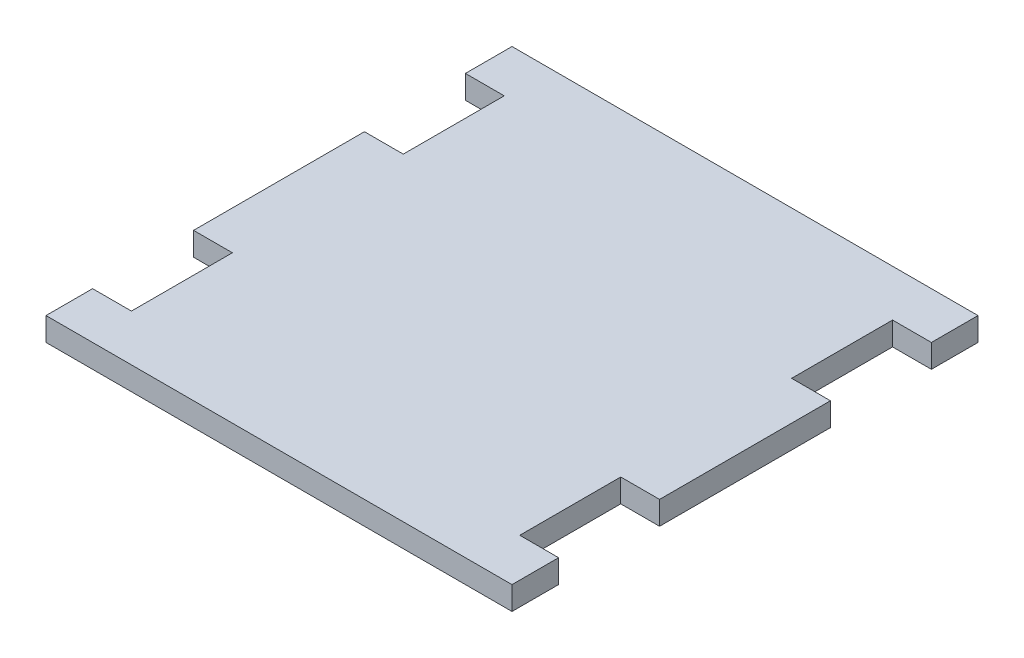
ISO-10303-21;
HEADER;
FILE_DESCRIPTION(('STEP AP214'),'2;1');
FILE_NAME('part.step','',(''),(''),'','','');
FILE_SCHEMA(('AUTOMOTIVE_DESIGN { 1 0 10303 214 1 1 1 1 }'));
ENDSEC;
DATA;
#1=APPLICATION_CONTEXT('core data for automotive mechanical design processes');
#2=APPLICATION_PROTOCOL_DEFINITION('international standard','automotive_design',2000,#1);
#3=PRODUCT_CONTEXT('',#1,'mechanical');
#4=PRODUCT('Part','Part','',(#3));
#5=PRODUCT_RELATED_PRODUCT_CATEGORY('part','',(#4));
#6=PRODUCT_DEFINITION_FORMATION('','',#4);
#7=PRODUCT_DEFINITION_CONTEXT('part definition',#1,'design');
#8=PRODUCT_DEFINITION('design','',#6,#7);
#9=PRODUCT_DEFINITION_SHAPE('','',#8);
#10=(LENGTH_UNIT() NAMED_UNIT(*) SI_UNIT(.MILLI.,.METRE.));
#11=(NAMED_UNIT(*) PLANE_ANGLE_UNIT() SI_UNIT($,.RADIAN.));
#12=(NAMED_UNIT(*) SI_UNIT($,.STERADIAN.) SOLID_ANGLE_UNIT());
#13=UNCERTAINTY_MEASURE_WITH_UNIT(LENGTH_MEASURE(1.E-05),#10,'distance_accuracy_value','');
#14=(GEOMETRIC_REPRESENTATION_CONTEXT(3) GLOBAL_UNCERTAINTY_ASSIGNED_CONTEXT((#13)) GLOBAL_UNIT_ASSIGNED_CONTEXT((#10,
#11,#12)) REPRESENTATION_CONTEXT('',''));
#15=CARTESIAN_POINT('',(0.,0.,0.));
#16=DIRECTION('',(0.,0.,1.));
#17=DIRECTION('',(1.,0.,0.));
#18=AXIS2_PLACEMENT_3D('',#15,#16,#17);
#19=CARTESIAN_POINT('',(150.,15.,150.));
#20=DIRECTION('',(-1.,0.,0.));
#21=DIRECTION('',(0.,0.,1.));
#22=AXIS2_PLACEMENT_3D('',#19,#20,#21);
#23=PLANE('',#22);
#24=DIRECTION('',(0.,1.,0.));
#25=VECTOR('',#24,1.);
#26=CARTESIAN_POINT('',(150.,-110.,-120.));
#27=LINE('',#26,#25);
#28=CARTESIAN_POINT('',(150.,0.,-120.));
#29=VERTEX_POINT('',#28);
#30=CARTESIAN_POINT('',(150.,15.,-120.));
#31=VERTEX_POINT('',#30);
#32=EDGE_CURVE('E267',#29,#31,#27,.T.);
#33=ORIENTED_EDGE('',*,*,#32,.F.);
#34=DIRECTION('',(0.,0.,-1.));
#35=VECTOR('',#34,1.);
#36=CARTESIAN_POINT('',(150.,0.,150.));
#37=LINE('',#36,#35);
#38=CARTESIAN_POINT('',(150.,0.,-150.));
#39=VERTEX_POINT('',#38);
#40=EDGE_CURVE('E266',#29,#39,#37,.T.);
#41=ORIENTED_EDGE('',*,*,#40,.T.);
#42=DIRECTION('',(0.,-1.,0.));
#43=VECTOR('',#42,1.);
#44=CARTESIAN_POINT('',(150.,15.,-150.));
#45=LINE('',#44,#43);
#46=CARTESIAN_POINT('',(150.,15.,-150.));
#47=VERTEX_POINT('',#46);
#48=EDGE_CURVE('E229',#47,#39,#45,.T.);
#49=ORIENTED_EDGE('',*,*,#48,.F.);
#50=DIRECTION('',(0.,0.,-1.));
#51=VECTOR('',#50,1.);
#52=CARTESIAN_POINT('',(150.,15.,150.));
#53=LINE('',#52,#51);
#54=EDGE_CURVE('E204',#31,#47,#53,.T.);
#55=ORIENTED_EDGE('',*,*,#54,.F.);
#56=EDGE_LOOP('',(#33,#41,#49,#55));
#57=FACE_BOUND('',#56,.T.);
#58=ADVANCED_FACE('F39',(#57),#23,.F.);
#59=CARTESIAN_POINT('',(150.,0.,55.));
#60=VERTEX_POINT('',#59);
#61=CARTESIAN_POINT('',(150.,0.,-55.));
#62=VERTEX_POINT('',#61);
#63=EDGE_CURVE('E339',#60,#62,#37,.T.);
#64=ORIENTED_EDGE('',*,*,#63,.T.);
#65=DIRECTION('',(0.,1.,0.));
#66=VECTOR('',#65,1.);
#67=CARTESIAN_POINT('',(150.,-110.,-55.));
#68=LINE('',#67,#66);
#69=CARTESIAN_POINT('',(150.,15.,-55.));
#70=VERTEX_POINT('',#69);
#71=EDGE_CURVE('E285',#62,#70,#68,.T.);
#72=ORIENTED_EDGE('',*,*,#71,.T.);
#73=CARTESIAN_POINT('',(150.,15.,55.));
#74=VERTEX_POINT('',#73);
#75=EDGE_CURVE('E205',#74,#70,#53,.T.);
#76=ORIENTED_EDGE('',*,*,#75,.F.);
#77=DIRECTION('',(0.,1.,0.));
#78=VECTOR('',#77,1.);
#79=CARTESIAN_POINT('',(150.,-110.,55.));
#80=LINE('',#79,#78);
#81=EDGE_CURVE('E186',#60,#74,#80,.T.);
#82=ORIENTED_EDGE('',*,*,#81,.F.);
#83=EDGE_LOOP('',(#64,#72,#76,#82));
#84=FACE_BOUND('',#83,.T.);
#85=ADVANCED_FACE('F380',(#84),#23,.F.);
#86=CARTESIAN_POINT('',(-150.,15.,150.));
#87=DIRECTION('',(1.,0.,0.));
#88=DIRECTION('',(0.,0.,-1.));
#89=AXIS2_PLACEMENT_3D('',#86,#87,#88);
#90=PLANE('',#89);
#91=DIRECTION('',(0.,1.,0.));
#92=VECTOR('',#91,1.);
#93=CARTESIAN_POINT('',(-150.,-110.,120.));
#94=LINE('',#93,#92);
#95=CARTESIAN_POINT('',(-150.,0.,120.));
#96=VERTEX_POINT('',#95);
#97=CARTESIAN_POINT('',(-150.,15.,120.));
#98=VERTEX_POINT('',#97);
#99=EDGE_CURVE('E286',#96,#98,#94,.T.);
#100=ORIENTED_EDGE('',*,*,#99,.F.);
#101=DIRECTION('',(0.,0.,1.));
#102=VECTOR('',#101,1.);
#103=CARTESIAN_POINT('',(-150.,0.,150.));
#104=LINE('',#103,#102);
#105=CARTESIAN_POINT('',(-150.,0.,150.));
#106=VERTEX_POINT('',#105);
#107=EDGE_CURVE('E217',#96,#106,#104,.T.);
#108=ORIENTED_EDGE('',*,*,#107,.T.);
#109=DIRECTION('',(0.,-1.,0.));
#110=VECTOR('',#109,1.);
#111=CARTESIAN_POINT('',(-150.,15.,150.));
#112=LINE('',#111,#110);
#113=CARTESIAN_POINT('',(-150.,15.,150.));
#114=VERTEX_POINT('',#113);
#115=EDGE_CURVE('E224',#114,#106,#112,.T.);
#116=ORIENTED_EDGE('',*,*,#115,.F.);
#117=DIRECTION('',(0.,0.,1.));
#118=VECTOR('',#117,1.);
#119=CARTESIAN_POINT('',(-150.,15.,150.));
#120=LINE('',#119,#118);
#121=EDGE_CURVE('E203',#98,#114,#120,.T.);
#122=ORIENTED_EDGE('',*,*,#121,.F.);
#123=EDGE_LOOP('',(#100,#108,#116,#122));
#124=FACE_BOUND('',#123,.T.);
#125=ADVANCED_FACE('F358',(#124),#90,.F.);
#126=CARTESIAN_POINT('',(-150.,0.,-55.));
#127=VERTEX_POINT('',#126);
#128=CARTESIAN_POINT('',(-150.,0.,55.));
#129=VERTEX_POINT('',#128);
#130=EDGE_CURVE('E216',#127,#129,#104,.T.);
#131=ORIENTED_EDGE('',*,*,#130,.T.);
#132=DIRECTION('',(0.,1.,0.));
#133=VECTOR('',#132,1.);
#134=CARTESIAN_POINT('',(-150.,-110.,55.));
#135=LINE('',#134,#133);
#136=CARTESIAN_POINT('',(-150.,15.,55.));
#137=VERTEX_POINT('',#136);
#138=EDGE_CURVE('E297',#129,#137,#135,.T.);
#139=ORIENTED_EDGE('',*,*,#138,.T.);
#140=CARTESIAN_POINT('',(-150.,15.,-55.));
#141=VERTEX_POINT('',#140);
#142=EDGE_CURVE('E328',#141,#137,#120,.T.);
#143=ORIENTED_EDGE('',*,*,#142,.F.);
#144=DIRECTION('',(0.,1.,0.));
#145=VECTOR('',#144,1.);
#146=CARTESIAN_POINT('',(-150.,-110.,-55.));
#147=LINE('',#146,#145);
#148=EDGE_CURVE('E311',#127,#141,#147,.T.);
#149=ORIENTED_EDGE('',*,*,#148,.F.);
#150=EDGE_LOOP('',(#131,#139,#143,#149));
#151=FACE_BOUND('',#150,.T.);
#152=ADVANCED_FACE('F335',(#151),#90,.F.);
#153=CARTESIAN_POINT('',(0.,15.,0.));
#154=DIRECTION('',(0.,-1.,0.));
#155=DIRECTION('',(0.,0.,-1.));
#156=AXIS2_PLACEMENT_3D('',#153,#154,#155);
#157=PLANE('',#156);
#158=DIRECTION('',(-1.,0.,0.));
#159=VECTOR('',#158,1.);
#160=CARTESIAN_POINT('',(150.,15.,-120.));
#161=LINE('',#160,#159);
#162=CARTESIAN_POINT('',(125.,15.,-120.));
#163=VERTEX_POINT('',#162);
#164=EDGE_CURVE('E290',#31,#163,#161,.T.);
#165=ORIENTED_EDGE('',*,*,#164,.F.);
#166=ORIENTED_EDGE('',*,*,#54,.T.);
#167=DIRECTION('',(-1.,0.,0.));
#168=VECTOR('',#167,1.);
#169=CARTESIAN_POINT('',(-150.,15.,-150.));
#170=LINE('',#169,#168);
#171=CARTESIAN_POINT('',(-150.,15.,-150.));
#172=VERTEX_POINT('',#171);
#173=EDGE_CURVE('E202',#47,#172,#170,.T.);
#174=ORIENTED_EDGE('',*,*,#173,.T.);
#175=CARTESIAN_POINT('',(-150.,15.,-120.));
#176=VERTEX_POINT('',#175);
#177=EDGE_CURVE('E333',#172,#176,#120,.T.);
#178=ORIENTED_EDGE('',*,*,#177,.T.);
#179=DIRECTION('',(-1.,0.,0.));
#180=VECTOR('',#179,1.);
#181=CARTESIAN_POINT('',(-150.,15.,-120.));
#182=LINE('',#181,#180);
#183=CARTESIAN_POINT('',(-125.,15.,-120.));
#184=VERTEX_POINT('',#183);
#185=EDGE_CURVE('E309',#184,#176,#182,.T.);
#186=ORIENTED_EDGE('',*,*,#185,.F.);
#187=DIRECTION('',(0.,0.,-1.));
#188=VECTOR('',#187,1.);
#189=CARTESIAN_POINT('',(-125.,15.,-120.));
#190=LINE('',#189,#188);
#191=CARTESIAN_POINT('',(-125.,15.,-55.));
#192=VERTEX_POINT('',#191);
#193=EDGE_CURVE('E308',#192,#184,#190,.T.);
#194=ORIENTED_EDGE('',*,*,#193,.F.);
#195=DIRECTION('',(1.,0.,0.));
#196=VECTOR('',#195,1.);
#197=CARTESIAN_POINT('',(-150.,15.,-55.));
#198=LINE('',#197,#196);
#199=EDGE_CURVE('E289',#141,#192,#198,.T.);
#200=ORIENTED_EDGE('',*,*,#199,.F.);
#201=ORIENTED_EDGE('',*,*,#142,.T.);
#202=DIRECTION('',(-1.,0.,0.));
#203=VECTOR('',#202,1.);
#204=CARTESIAN_POINT('',(-150.,15.,55.));
#205=LINE('',#204,#203);
#206=CARTESIAN_POINT('',(-125.,15.,55.));
#207=VERTEX_POINT('',#206);
#208=EDGE_CURVE('E295',#207,#137,#205,.T.);
#209=ORIENTED_EDGE('',*,*,#208,.F.);
#210=DIRECTION('',(0.,0.,-1.));
#211=VECTOR('',#210,1.);
#212=CARTESIAN_POINT('',(-125.,15.,55.));
#213=LINE('',#212,#211);
#214=CARTESIAN_POINT('',(-125.,15.,120.));
#215=VERTEX_POINT('',#214);
#216=EDGE_CURVE('E296',#215,#207,#213,.T.);
#217=ORIENTED_EDGE('',*,*,#216,.F.);
#218=DIRECTION('',(1.,0.,0.));
#219=VECTOR('',#218,1.);
#220=CARTESIAN_POINT('',(-150.,15.,120.));
#221=LINE('',#220,#219);
#222=EDGE_CURVE('E281',#98,#215,#221,.T.);
#223=ORIENTED_EDGE('',*,*,#222,.F.);
#224=ORIENTED_EDGE('',*,*,#121,.T.);
#225=DIRECTION('',(1.,0.,0.));
#226=VECTOR('',#225,1.);
#227=CARTESIAN_POINT('',(-150.,15.,150.));
#228=LINE('',#227,#226);
#229=CARTESIAN_POINT('',(150.,15.,150.));
#230=VERTEX_POINT('',#229);
#231=EDGE_CURVE('E199',#114,#230,#228,.T.);
#232=ORIENTED_EDGE('',*,*,#231,.T.);
#233=CARTESIAN_POINT('',(150.,15.,120.));
#234=VERTEX_POINT('',#233);
#235=EDGE_CURVE('E195',#230,#234,#53,.T.);
#236=ORIENTED_EDGE('',*,*,#235,.T.);
#237=DIRECTION('',(1.,0.,0.));
#238=VECTOR('',#237,1.);
#239=CARTESIAN_POINT('',(150.,15.,120.));
#240=LINE('',#239,#238);
#241=CARTESIAN_POINT('',(125.,15.,120.));
#242=VERTEX_POINT('',#241);
#243=EDGE_CURVE('E174',#242,#234,#240,.T.);
#244=ORIENTED_EDGE('',*,*,#243,.F.);
#245=DIRECTION('',(0.,0.,1.));
#246=VECTOR('',#245,1.);
#247=CARTESIAN_POINT('',(125.,15.,55.));
#248=LINE('',#247,#246);
#249=CARTESIAN_POINT('',(125.,15.,55.));
#250=VERTEX_POINT('',#249);
#251=EDGE_CURVE('E184',#250,#242,#248,.T.);
#252=ORIENTED_EDGE('',*,*,#251,.F.);
#253=DIRECTION('',(-1.,0.,0.));
#254=VECTOR('',#253,1.);
#255=CARTESIAN_POINT('',(150.,15.,55.));
#256=LINE('',#255,#254);
#257=EDGE_CURVE('E277',#74,#250,#256,.T.);
#258=ORIENTED_EDGE('',*,*,#257,.F.);
#259=ORIENTED_EDGE('',*,*,#75,.T.);
#260=DIRECTION('',(1.,0.,0.));
#261=VECTOR('',#260,1.);
#262=CARTESIAN_POINT('',(150.,15.,-55.));
#263=LINE('',#262,#261);
#264=CARTESIAN_POINT('',(125.,15.,-55.));
#265=VERTEX_POINT('',#264);
#266=EDGE_CURVE('E275',#265,#70,#263,.T.);
#267=ORIENTED_EDGE('',*,*,#266,.F.);
#268=DIRECTION('',(0.,0.,1.));
#269=VECTOR('',#268,1.);
#270=CARTESIAN_POINT('',(125.,15.,-120.));
#271=LINE('',#270,#269);
#272=EDGE_CURVE('E272',#163,#265,#271,.T.);
#273=ORIENTED_EDGE('',*,*,#272,.F.);
#274=EDGE_LOOP('',(#165,#166,#174,#178,#186,#194,#200,#201,#209,#217,#223,#224,#232,#236,#244,
#252,#258,#259,#267,#273));
#275=FACE_BOUND('',#274,.T.);
#276=ADVANCED_FACE('F200',(#275),#157,.F.);
#277=CARTESIAN_POINT('',(150.,0.,150.));
#278=VERTEX_POINT('',#277);
#279=CARTESIAN_POINT('',(150.,0.,120.));
#280=VERTEX_POINT('',#279);
#281=EDGE_CURVE('E191',#278,#280,#37,.T.);
#282=ORIENTED_EDGE('',*,*,#281,.T.);
#283=DIRECTION('',(0.,1.,0.));
#284=VECTOR('',#283,1.);
#285=CARTESIAN_POINT('',(150.,-110.,120.));
#286=LINE('',#285,#284);
#287=EDGE_CURVE('E180',#280,#234,#286,.T.);
#288=ORIENTED_EDGE('',*,*,#287,.T.);
#289=ORIENTED_EDGE('',*,*,#235,.F.);
#290=DIRECTION('',(0.,-1.,0.));
#291=VECTOR('',#290,1.);
#292=CARTESIAN_POINT('',(150.,15.,150.));
#293=LINE('',#292,#291);
#294=EDGE_CURVE('E223',#230,#278,#293,.T.);
#295=ORIENTED_EDGE('',*,*,#294,.T.);
#296=EDGE_LOOP('',(#282,#288,#289,#295));
#297=FACE_BOUND('',#296,.T.);
#298=ADVANCED_FACE('F41',(#297),#23,.F.);
#299=CARTESIAN_POINT('',(-150.,15.,-150.));
#300=DIRECTION('',(0.,0.,1.));
#301=DIRECTION('',(1.,0.,0.));
#302=AXIS2_PLACEMENT_3D('',#299,#300,#301);
#303=PLANE('',#302);
#304=DIRECTION('',(-1.,0.,0.));
#305=VECTOR('',#304,1.);
#306=CARTESIAN_POINT('',(-150.,0.,-150.));
#307=LINE('',#306,#305);
#308=CARTESIAN_POINT('',(-150.,0.,-150.));
#309=VERTEX_POINT('',#308);
#310=EDGE_CURVE('E336',#39,#309,#307,.T.);
#311=ORIENTED_EDGE('',*,*,#310,.T.);
#312=DIRECTION('',(0.,-1.,0.));
#313=VECTOR('',#312,1.);
#314=CARTESIAN_POINT('',(-150.,15.,-150.));
#315=LINE('',#314,#313);
#316=EDGE_CURVE('E230',#172,#309,#315,.T.);
#317=ORIENTED_EDGE('',*,*,#316,.F.);
#318=ORIENTED_EDGE('',*,*,#173,.F.);
#319=ORIENTED_EDGE('',*,*,#48,.T.);
#320=EDGE_LOOP('',(#311,#317,#318,#319));
#321=FACE_BOUND('',#320,.T.);
#322=ADVANCED_FACE('F400',(#321),#303,.F.);
#323=CARTESIAN_POINT('',(-150.,0.,-120.));
#324=VERTEX_POINT('',#323);
#325=EDGE_CURVE('E212',#309,#324,#104,.T.);
#326=ORIENTED_EDGE('',*,*,#325,.T.);
#327=DIRECTION('',(0.,1.,0.));
#328=VECTOR('',#327,1.);
#329=CARTESIAN_POINT('',(-150.,-110.,-120.));
#330=LINE('',#329,#328);
#331=EDGE_CURVE('E315',#324,#176,#330,.T.);
#332=ORIENTED_EDGE('',*,*,#331,.T.);
#333=ORIENTED_EDGE('',*,*,#177,.F.);
#334=ORIENTED_EDGE('',*,*,#316,.T.);
#335=EDGE_LOOP('',(#326,#332,#333,#334));
#336=FACE_BOUND('',#335,.T.);
#337=ADVANCED_FACE('F403',(#336),#90,.F.);
#338=CARTESIAN_POINT('',(-150.,15.,150.));
#339=DIRECTION('',(0.,0.,-1.));
#340=DIRECTION('',(-1.,0.,0.));
#341=AXIS2_PLACEMENT_3D('',#338,#339,#340);
#342=PLANE('',#341);
#343=DIRECTION('',(1.,0.,0.));
#344=VECTOR('',#343,1.);
#345=CARTESIAN_POINT('',(-150.,0.,150.));
#346=LINE('',#345,#344);
#347=EDGE_CURVE('E209',#106,#278,#346,.T.);
#348=ORIENTED_EDGE('',*,*,#347,.T.);
#349=ORIENTED_EDGE('',*,*,#294,.F.);
#350=ORIENTED_EDGE('',*,*,#231,.F.);
#351=ORIENTED_EDGE('',*,*,#115,.T.);
#352=EDGE_LOOP('',(#348,#349,#350,#351));
#353=FACE_BOUND('',#352,.T.);
#354=ADVANCED_FACE('F357',(#353),#342,.F.);
#355=CARTESIAN_POINT('',(0.,0.,0.));
#356=DIRECTION('',(0.,-1.,0.));
#357=DIRECTION('',(0.,0.,-1.));
#358=AXIS2_PLACEMENT_3D('',#355,#356,#357);
#359=PLANE('',#358);
#360=DIRECTION('',(-1.,0.,0.));
#361=VECTOR('',#360,1.);
#362=CARTESIAN_POINT('',(0.,0.,-54.9999999999999));
#363=LINE('',#362,#361);
#364=CARTESIAN_POINT('',(125.,0.,-55.));
#365=VERTEX_POINT('',#364);
#366=EDGE_CURVE('E11',#62,#365,#363,.T.);
#367=ORIENTED_EDGE('',*,*,#366,.F.);
#368=ORIENTED_EDGE('',*,*,#63,.F.);
#369=DIRECTION('',(1.,0.,0.));
#370=VECTOR('',#369,1.);
#371=CARTESIAN_POINT('',(0.,0.,55.));
#372=LINE('',#371,#370);
#373=CARTESIAN_POINT('',(125.,0.,55.));
#374=VERTEX_POINT('',#373);
#375=EDGE_CURVE('E238',#374,#60,#372,.T.);
#376=ORIENTED_EDGE('',*,*,#375,.F.);
#377=DIRECTION('',(0.,0.,-1.));
#378=VECTOR('',#377,1.);
#379=CARTESIAN_POINT('',(125.,0.,0.));
#380=LINE('',#379,#378);
#381=CARTESIAN_POINT('',(125.,0.,120.));
#382=VERTEX_POINT('',#381);
#383=EDGE_CURVE('E245',#382,#374,#380,.T.);
#384=ORIENTED_EDGE('',*,*,#383,.F.);
#385=DIRECTION('',(-1.,0.,0.));
#386=VECTOR('',#385,1.);
#387=CARTESIAN_POINT('',(0.,0.,120.));
#388=LINE('',#387,#386);
#389=EDGE_CURVE('E241',#280,#382,#388,.T.);
#390=ORIENTED_EDGE('',*,*,#389,.F.);
#391=ORIENTED_EDGE('',*,*,#281,.F.);
#392=ORIENTED_EDGE('',*,*,#347,.F.);
#393=ORIENTED_EDGE('',*,*,#107,.F.);
#394=DIRECTION('',(-1.,0.,0.));
#395=VECTOR('',#394,1.);
#396=CARTESIAN_POINT('',(0.,0.,120.));
#397=LINE('',#396,#395);
#398=CARTESIAN_POINT('',(-125.,0.,120.));
#399=VERTEX_POINT('',#398);
#400=EDGE_CURVE('E250',#399,#96,#397,.T.);
#401=ORIENTED_EDGE('',*,*,#400,.F.);
#402=DIRECTION('',(0.,0.,1.));
#403=VECTOR('',#402,1.);
#404=CARTESIAN_POINT('',(-125.,0.,0.));
#405=LINE('',#404,#403);
#406=CARTESIAN_POINT('',(-125.,0.,55.));
#407=VERTEX_POINT('',#406);
#408=EDGE_CURVE('E249',#407,#399,#405,.T.);
#409=ORIENTED_EDGE('',*,*,#408,.F.);
#410=DIRECTION('',(1.,0.,0.));
#411=VECTOR('',#410,1.);
#412=CARTESIAN_POINT('',(0.,0.,55.));
#413=LINE('',#412,#411);
#414=EDGE_CURVE('E252',#129,#407,#413,.T.);
#415=ORIENTED_EDGE('',*,*,#414,.F.);
#416=ORIENTED_EDGE('',*,*,#130,.F.);
#417=DIRECTION('',(-1.,0.,0.));
#418=VECTOR('',#417,1.);
#419=CARTESIAN_POINT('',(0.,0.,-55.));
#420=LINE('',#419,#418);
#421=CARTESIAN_POINT('',(-125.,0.,-55.));
#422=VERTEX_POINT('',#421);
#423=EDGE_CURVE('E232',#422,#127,#420,.T.);
#424=ORIENTED_EDGE('',*,*,#423,.F.);
#425=DIRECTION('',(0.,0.,1.));
#426=VECTOR('',#425,1.);
#427=CARTESIAN_POINT('',(-125.,0.,0.));
#428=LINE('',#427,#426);
#429=CARTESIAN_POINT('',(-125.,0.,-120.));
#430=VERTEX_POINT('',#429);
#431=EDGE_CURVE('E234',#430,#422,#428,.T.);
#432=ORIENTED_EDGE('',*,*,#431,.F.);
#433=DIRECTION('',(1.,0.,0.));
#434=VECTOR('',#433,1.);
#435=CARTESIAN_POINT('',(0.,0.,-120.));
#436=LINE('',#435,#434);
#437=EDGE_CURVE('E239',#324,#430,#436,.T.);
#438=ORIENTED_EDGE('',*,*,#437,.F.);
#439=ORIENTED_EDGE('',*,*,#325,.F.);
#440=ORIENTED_EDGE('',*,*,#310,.F.);
#441=ORIENTED_EDGE('',*,*,#40,.F.);
#442=DIRECTION('',(1.,0.,0.));
#443=VECTOR('',#442,1.);
#444=CARTESIAN_POINT('',(-1.33226762955019E-13,0.,-120.));
#445=LINE('',#444,#443);
#446=CARTESIAN_POINT('',(125.,0.,-120.));
#447=VERTEX_POINT('',#446);
#448=EDGE_CURVE('E253',#447,#29,#445,.T.);
#449=ORIENTED_EDGE('',*,*,#448,.F.);
#450=DIRECTION('',(0.,0.,-1.));
#451=VECTOR('',#450,1.);
#452=CARTESIAN_POINT('',(125.,0.,0.));
#453=LINE('',#452,#451);
#454=EDGE_CURVE('E50',#365,#447,#453,.T.);
#455=ORIENTED_EDGE('',*,*,#454,.F.);
#456=EDGE_LOOP('',(#367,#368,#376,#384,#390,#391,#392,#393,#401,#409,#415,#416,#424,#432,#438,
#439,#440,#441,#449,#455));
#457=FACE_BOUND('',#456,.T.);
#458=ADVANCED_FACE('F264',(#457),#359,.T.);
#459=CARTESIAN_POINT('',(-150.,-110.,-120.));
#460=DIRECTION('',(0.,0.,-1.));
#461=DIRECTION('',(-1.,0.,0.));
#462=AXIS2_PLACEMENT_3D('',#459,#460,#461);
#463=PLANE('',#462);
#464=ORIENTED_EDGE('',*,*,#437,.T.);
#465=DIRECTION('',(0.,1.,0.));
#466=VECTOR('',#465,1.);
#467=CARTESIAN_POINT('',(-125.,-110.,-120.));
#468=LINE('',#467,#466);
#469=EDGE_CURVE('E314',#430,#184,#468,.T.);
#470=ORIENTED_EDGE('',*,*,#469,.T.);
#471=ORIENTED_EDGE('',*,*,#185,.T.);
#472=ORIENTED_EDGE('',*,*,#331,.F.);
#473=EDGE_LOOP('',(#464,#470,#471,#472));
#474=FACE_BOUND('',#473,.T.);
#475=ADVANCED_FACE('F413',(#474),#463,.F.);
#476=CARTESIAN_POINT('',(-125.,-110.,-120.));
#477=DIRECTION('',(1.,0.,0.));
#478=DIRECTION('',(0.,0.,-1.));
#479=AXIS2_PLACEMENT_3D('',#476,#477,#478);
#480=PLANE('',#479);
#481=ORIENTED_EDGE('',*,*,#431,.T.);
#482=DIRECTION('',(0.,1.,0.));
#483=VECTOR('',#482,1.);
#484=CARTESIAN_POINT('',(-125.,-110.,-55.));
#485=LINE('',#484,#483);
#486=EDGE_CURVE('E320',#422,#192,#485,.T.);
#487=ORIENTED_EDGE('',*,*,#486,.T.);
#488=ORIENTED_EDGE('',*,*,#193,.T.);
#489=ORIENTED_EDGE('',*,*,#469,.F.);
#490=EDGE_LOOP('',(#481,#487,#488,#489));
#491=FACE_BOUND('',#490,.T.);
#492=ADVANCED_FACE('F447',(#491),#480,.F.);
#493=CARTESIAN_POINT('',(-150.,-110.,-55.));
#494=DIRECTION('',(0.,0.,1.));
#495=DIRECTION('',(1.,0.,0.));
#496=AXIS2_PLACEMENT_3D('',#493,#494,#495);
#497=PLANE('',#496);
#498=ORIENTED_EDGE('',*,*,#423,.T.);
#499=ORIENTED_EDGE('',*,*,#148,.T.);
#500=ORIENTED_EDGE('',*,*,#199,.T.);
#501=ORIENTED_EDGE('',*,*,#486,.F.);
#502=EDGE_LOOP('',(#498,#499,#500,#501));
#503=FACE_BOUND('',#502,.T.);
#504=ADVANCED_FACE('F321',(#503),#497,.F.);
#505=CARTESIAN_POINT('',(150.,-110.,120.));
#506=DIRECTION('',(0.,0.,1.));
#507=DIRECTION('',(1.,0.,0.));
#508=AXIS2_PLACEMENT_3D('',#505,#506,#507);
#509=PLANE('',#508);
#510=ORIENTED_EDGE('',*,*,#389,.T.);
#511=DIRECTION('',(0.,1.,0.));
#512=VECTOR('',#511,1.);
#513=CARTESIAN_POINT('',(125.,-110.,120.));
#514=LINE('',#513,#512);
#515=EDGE_CURVE('E179',#382,#242,#514,.T.);
#516=ORIENTED_EDGE('',*,*,#515,.T.);
#517=ORIENTED_EDGE('',*,*,#243,.T.);
#518=ORIENTED_EDGE('',*,*,#287,.F.);
#519=EDGE_LOOP('',(#510,#516,#517,#518));
#520=FACE_BOUND('',#519,.T.);
#521=ADVANCED_FACE('F176',(#520),#509,.F.);
#522=CARTESIAN_POINT('',(125.,-110.,55.));
#523=DIRECTION('',(-1.,0.,0.));
#524=DIRECTION('',(0.,0.,1.));
#525=AXIS2_PLACEMENT_3D('',#522,#523,#524);
#526=PLANE('',#525);
#527=ORIENTED_EDGE('',*,*,#383,.T.);
#528=DIRECTION('',(0.,1.,0.));
#529=VECTOR('',#528,1.);
#530=CARTESIAN_POINT('',(125.,-110.,55.));
#531=LINE('',#530,#529);
#532=EDGE_CURVE('E362',#374,#250,#531,.T.);
#533=ORIENTED_EDGE('',*,*,#532,.T.);
#534=ORIENTED_EDGE('',*,*,#251,.T.);
#535=ORIENTED_EDGE('',*,*,#515,.F.);
#536=EDGE_LOOP('',(#527,#533,#534,#535));
#537=FACE_BOUND('',#536,.T.);
#538=ADVANCED_FACE('F363',(#537),#526,.F.);
#539=CARTESIAN_POINT('',(150.,-110.,55.));
#540=DIRECTION('',(0.,0.,-1.));
#541=DIRECTION('',(-1.,0.,0.));
#542=AXIS2_PLACEMENT_3D('',#539,#540,#541);
#543=PLANE('',#542);
#544=ORIENTED_EDGE('',*,*,#375,.T.);
#545=ORIENTED_EDGE('',*,*,#81,.T.);
#546=ORIENTED_EDGE('',*,*,#257,.T.);
#547=ORIENTED_EDGE('',*,*,#532,.F.);
#548=EDGE_LOOP('',(#544,#545,#546,#547));
#549=FACE_BOUND('',#548,.T.);
#550=ADVANCED_FACE('F372',(#549),#543,.F.);
#551=CARTESIAN_POINT('',(-150.,-110.,55.));
#552=DIRECTION('',(0.,0.,-1.));
#553=DIRECTION('',(-1.,0.,0.));
#554=AXIS2_PLACEMENT_3D('',#551,#552,#553);
#555=PLANE('',#554);
#556=ORIENTED_EDGE('',*,*,#414,.T.);
#557=DIRECTION('',(0.,1.,0.));
#558=VECTOR('',#557,1.);
#559=CARTESIAN_POINT('',(-125.,-110.,55.));
#560=LINE('',#559,#558);
#561=EDGE_CURVE('E294',#407,#207,#560,.T.);
#562=ORIENTED_EDGE('',*,*,#561,.T.);
#563=ORIENTED_EDGE('',*,*,#208,.T.);
#564=ORIENTED_EDGE('',*,*,#138,.F.);
#565=EDGE_LOOP('',(#556,#562,#563,#564));
#566=FACE_BOUND('',#565,.T.);
#567=ADVANCED_FACE('F355',(#566),#555,.F.);
#568=CARTESIAN_POINT('',(-125.,-110.,55.));
#569=DIRECTION('',(1.,0.,0.));
#570=DIRECTION('',(0.,0.,-1.));
#571=AXIS2_PLACEMENT_3D('',#568,#569,#570);
#572=PLANE('',#571);
#573=ORIENTED_EDGE('',*,*,#408,.T.);
#574=DIRECTION('',(0.,1.,0.));
#575=VECTOR('',#574,1.);
#576=CARTESIAN_POINT('',(-125.,-110.,120.));
#577=LINE('',#576,#575);
#578=EDGE_CURVE('E65',#399,#215,#577,.T.);
#579=ORIENTED_EDGE('',*,*,#578,.T.);
#580=ORIENTED_EDGE('',*,*,#216,.T.);
#581=ORIENTED_EDGE('',*,*,#561,.F.);
#582=EDGE_LOOP('',(#573,#579,#580,#581));
#583=FACE_BOUND('',#582,.T.);
#584=ADVANCED_FACE('F354',(#583),#572,.F.);
#585=CARTESIAN_POINT('',(-150.,-110.,120.));
#586=DIRECTION('',(0.,0.,1.));
#587=DIRECTION('',(1.,0.,0.));
#588=AXIS2_PLACEMENT_3D('',#585,#586,#587);
#589=PLANE('',#588);
#590=ORIENTED_EDGE('',*,*,#400,.T.);
#591=ORIENTED_EDGE('',*,*,#99,.T.);
#592=ORIENTED_EDGE('',*,*,#222,.T.);
#593=ORIENTED_EDGE('',*,*,#578,.F.);
#594=EDGE_LOOP('',(#590,#591,#592,#593));
#595=FACE_BOUND('',#594,.T.);
#596=ADVANCED_FACE('F381',(#595),#589,.F.);
#597=CARTESIAN_POINT('',(150.,-110.,-55.));
#598=DIRECTION('',(0.,0.,1.));
#599=DIRECTION('',(1.,0.,0.));
#600=AXIS2_PLACEMENT_3D('',#597,#598,#599);
#601=PLANE('',#600);
#602=ORIENTED_EDGE('',*,*,#366,.T.);
#603=DIRECTION('',(0.,1.,0.));
#604=VECTOR('',#603,1.);
#605=CARTESIAN_POINT('',(125.,-110.,-55.));
#606=LINE('',#605,#604);
#607=EDGE_CURVE('E259',#365,#265,#606,.T.);
#608=ORIENTED_EDGE('',*,*,#607,.T.);
#609=ORIENTED_EDGE('',*,*,#266,.T.);
#610=ORIENTED_EDGE('',*,*,#71,.F.);
#611=EDGE_LOOP('',(#602,#608,#609,#610));
#612=FACE_BOUND('',#611,.T.);
#613=ADVANCED_FACE('F376',(#612),#601,.F.);
#614=CARTESIAN_POINT('',(125.,-110.,-120.));
#615=DIRECTION('',(-1.,0.,0.));
#616=DIRECTION('',(0.,0.,1.));
#617=AXIS2_PLACEMENT_3D('',#614,#615,#616);
#618=PLANE('',#617);
#619=ORIENTED_EDGE('',*,*,#454,.T.);
#620=DIRECTION('',(0.,1.,0.));
#621=VECTOR('',#620,1.);
#622=CARTESIAN_POINT('',(125.,-110.,-120.));
#623=LINE('',#622,#621);
#624=EDGE_CURVE('E53',#447,#163,#623,.T.);
#625=ORIENTED_EDGE('',*,*,#624,.T.);
#626=ORIENTED_EDGE('',*,*,#272,.T.);
#627=ORIENTED_EDGE('',*,*,#607,.F.);
#628=EDGE_LOOP('',(#619,#625,#626,#627));
#629=FACE_BOUND('',#628,.T.);
#630=ADVANCED_FACE('F256',(#629),#618,.F.);
#631=CARTESIAN_POINT('',(150.,-110.,-120.));
#632=DIRECTION('',(0.,0.,-1.));
#633=DIRECTION('',(-1.,0.,0.));
#634=AXIS2_PLACEMENT_3D('',#631,#632,#633);
#635=PLANE('',#634);
#636=ORIENTED_EDGE('',*,*,#448,.T.);
#637=ORIENTED_EDGE('',*,*,#32,.T.);
#638=ORIENTED_EDGE('',*,*,#164,.T.);
#639=ORIENTED_EDGE('',*,*,#624,.F.);
#640=EDGE_LOOP('',(#636,#637,#638,#639));
#641=FACE_BOUND('',#640,.T.);
#642=ADVANCED_FACE('F268',(#641),#635,.F.);
#643=CLOSED_SHELL('',(#58,#85,#125,#152,#276,#298,#322,#337,#354,#458,#475,#492,#504,#521,#538,
#550,#567,#584,#596,#613,#630,#642));
#644=MANIFOLD_SOLID_BREP('B2',#643);
#645=ADVANCED_BREP_SHAPE_REPRESENTATION('',(#18,#644),#14);
#646=SHAPE_DEFINITION_REPRESENTATION(#9,#645);
ENDSEC;
END-ISO-10303-21;
